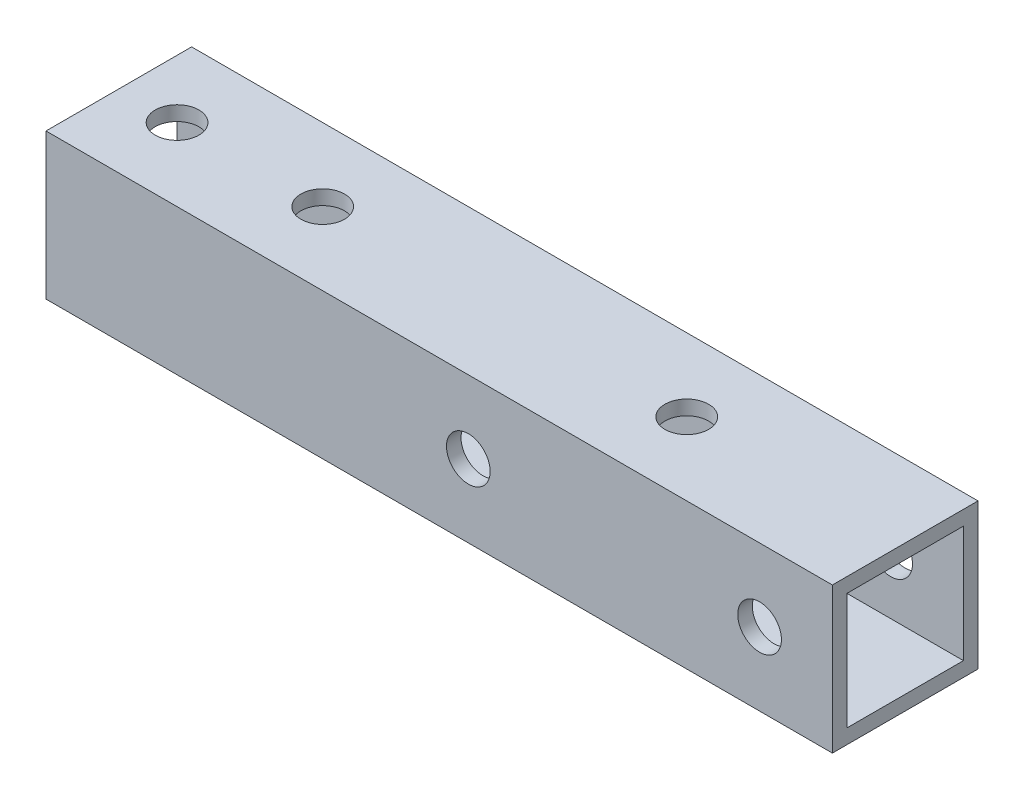
ISO-10303-21;
HEADER;
FILE_DESCRIPTION(('STEP AP214'),'2;1');
FILE_NAME('part.step','',(''),(''),'','','');
FILE_SCHEMA(('AUTOMOTIVE_DESIGN { 1 0 10303 214 1 1 1 1 }'));
ENDSEC;
DATA;
#1=APPLICATION_CONTEXT('core data for automotive mechanical design processes');
#2=APPLICATION_PROTOCOL_DEFINITION('international standard','automotive_design',2000,#1);
#3=PRODUCT_CONTEXT('',#1,'mechanical');
#4=PRODUCT('Part','Part','',(#3));
#5=PRODUCT_RELATED_PRODUCT_CATEGORY('part','',(#4));
#6=PRODUCT_DEFINITION_FORMATION('','',#4);
#7=PRODUCT_DEFINITION_CONTEXT('part definition',#1,'design');
#8=PRODUCT_DEFINITION('design','',#6,#7);
#9=PRODUCT_DEFINITION_SHAPE('','',#8);
#10=(LENGTH_UNIT() NAMED_UNIT(*) SI_UNIT(.MILLI.,.METRE.));
#11=(NAMED_UNIT(*) PLANE_ANGLE_UNIT() SI_UNIT($,.RADIAN.));
#12=(NAMED_UNIT(*) SI_UNIT($,.STERADIAN.) SOLID_ANGLE_UNIT());
#13=UNCERTAINTY_MEASURE_WITH_UNIT(LENGTH_MEASURE(1.E-05),#10,'distance_accuracy_value','');
#14=(GEOMETRIC_REPRESENTATION_CONTEXT(3) GLOBAL_UNCERTAINTY_ASSIGNED_CONTEXT((#13)) GLOBAL_UNIT_ASSIGNED_CONTEXT((#10,
#11,#12)) REPRESENTATION_CONTEXT('',''));
#15=CARTESIAN_POINT('',(0.,0.,0.));
#16=DIRECTION('',(0.,0.,1.));
#17=DIRECTION('',(1.,0.,0.));
#18=AXIS2_PLACEMENT_3D('',#15,#16,#17);
#19=CARTESIAN_POINT('',(54.,0.,0.));
#20=DIRECTION('',(1.,0.,0.));
#21=DIRECTION('',(0.,0.,-1.));
#22=AXIS2_PLACEMENT_3D('',#19,#20,#21);
#23=PLANE('',#22);
#24=DIRECTION('',(0.,1.,0.));
#25=VECTOR('',#24,1.);
#26=CARTESIAN_POINT('',(54.,-5.,-5.));
#27=LINE('',#26,#25);
#28=CARTESIAN_POINT('',(54.,-5.,-5.));
#29=VERTEX_POINT('',#28);
#30=CARTESIAN_POINT('',(54.,5.,-5.));
#31=VERTEX_POINT('',#30);
#32=EDGE_CURVE('E162',#29,#31,#27,.T.);
#33=ORIENTED_EDGE('',*,*,#32,.T.);
#34=DIRECTION('',(0.,0.,1.));
#35=VECTOR('',#34,1.);
#36=CARTESIAN_POINT('',(54.,5.,5.));
#37=LINE('',#36,#35);
#38=CARTESIAN_POINT('',(54.,5.,5.));
#39=VERTEX_POINT('',#38);
#40=EDGE_CURVE('E165',#31,#39,#37,.T.);
#41=ORIENTED_EDGE('',*,*,#40,.T.);
#42=DIRECTION('',(0.,-1.,0.));
#43=VECTOR('',#42,1.);
#44=CARTESIAN_POINT('',(54.,-5.,5.));
#45=LINE('',#44,#43);
#46=CARTESIAN_POINT('',(54.,-5.,5.));
#47=VERTEX_POINT('',#46);
#48=EDGE_CURVE('E168',#39,#47,#45,.T.);
#49=ORIENTED_EDGE('',*,*,#48,.T.);
#50=DIRECTION('',(0.,0.,-1.));
#51=VECTOR('',#50,1.);
#52=CARTESIAN_POINT('',(54.,-5.,5.));
#53=LINE('',#52,#51);
#54=EDGE_CURVE('E170',#47,#29,#53,.T.);
#55=ORIENTED_EDGE('',*,*,#54,.T.);
#56=EDGE_LOOP('',(#33,#41,#49,#55));
#57=FACE_BOUND('',#56,.T.);
#58=DIRECTION('',(0.,0.,1.));
#59=VECTOR('',#58,1.);
#60=CARTESIAN_POINT('',(54.,4.,0.));
#61=LINE('',#60,#59);
#62=CARTESIAN_POINT('',(54.,4.,-4.));
#63=VERTEX_POINT('',#62);
#64=CARTESIAN_POINT('',(54.,4.,4.));
#65=VERTEX_POINT('',#64);
#66=EDGE_CURVE('E132',#63,#65,#61,.T.);
#67=ORIENTED_EDGE('',*,*,#66,.F.);
#68=DIRECTION('',(0.,1.,0.));
#69=VECTOR('',#68,1.);
#70=CARTESIAN_POINT('',(54.,0.,-4.));
#71=LINE('',#70,#69);
#72=CARTESIAN_POINT('',(54.,-4.,-4.));
#73=VERTEX_POINT('',#72);
#74=EDGE_CURVE('E124',#73,#63,#71,.T.);
#75=ORIENTED_EDGE('',*,*,#74,.F.);
#76=DIRECTION('',(0.,0.,-1.));
#77=VECTOR('',#76,1.);
#78=CARTESIAN_POINT('',(54.,-4.,0.));
#79=LINE('',#78,#77);
#80=CARTESIAN_POINT('',(54.,-4.,4.));
#81=VERTEX_POINT('',#80);
#82=EDGE_CURVE('E146',#81,#73,#79,.T.);
#83=ORIENTED_EDGE('',*,*,#82,.F.);
#84=DIRECTION('',(0.,-1.,0.));
#85=VECTOR('',#84,1.);
#86=CARTESIAN_POINT('',(54.,0.,4.));
#87=LINE('',#86,#85);
#88=EDGE_CURVE('E144',#65,#81,#87,.T.);
#89=ORIENTED_EDGE('',*,*,#88,.F.);
#90=EDGE_LOOP('',(#67,#75,#83,#89));
#91=FACE_BOUND('',#90,.T.);
#92=ADVANCED_FACE('F57',(#57,#91),#23,.T.);
#93=CARTESIAN_POINT('',(0.,0.,0.));
#94=DIRECTION('',(1.,0.,0.));
#95=DIRECTION('',(0.,0.,-1.));
#96=AXIS2_PLACEMENT_3D('',#93,#94,#95);
#97=PLANE('',#96);
#98=DIRECTION('',(0.,1.,0.));
#99=VECTOR('',#98,1.);
#100=CARTESIAN_POINT('',(0.,-5.,-5.));
#101=LINE('',#100,#99);
#102=CARTESIAN_POINT('',(0.,-5.,-5.));
#103=VERTEX_POINT('',#102);
#104=CARTESIAN_POINT('',(0.,5.,-5.));
#105=VERTEX_POINT('',#104);
#106=EDGE_CURVE('E140',#103,#105,#101,.T.);
#107=ORIENTED_EDGE('',*,*,#106,.F.);
#108=DIRECTION('',(0.,0.,-1.));
#109=VECTOR('',#108,1.);
#110=CARTESIAN_POINT('',(0.,-5.,5.));
#111=LINE('',#110,#109);
#112=CARTESIAN_POINT('',(0.,-5.,5.));
#113=VERTEX_POINT('',#112);
#114=EDGE_CURVE('E166',#113,#103,#111,.T.);
#115=ORIENTED_EDGE('',*,*,#114,.F.);
#116=DIRECTION('',(0.,-1.,0.));
#117=VECTOR('',#116,1.);
#118=CARTESIAN_POINT('',(0.,-5.,5.));
#119=LINE('',#118,#117);
#120=CARTESIAN_POINT('',(0.,5.,5.));
#121=VERTEX_POINT('',#120);
#122=EDGE_CURVE('E177',#121,#113,#119,.T.);
#123=ORIENTED_EDGE('',*,*,#122,.F.);
#124=DIRECTION('',(0.,0.,1.));
#125=VECTOR('',#124,1.);
#126=CARTESIAN_POINT('',(0.,5.,5.));
#127=LINE('',#126,#125);
#128=EDGE_CURVE('E175',#105,#121,#127,.T.);
#129=ORIENTED_EDGE('',*,*,#128,.F.);
#130=EDGE_LOOP('',(#107,#115,#123,#129));
#131=FACE_BOUND('',#130,.T.);
#132=DIRECTION('',(0.,1.,0.));
#133=VECTOR('',#132,1.);
#134=CARTESIAN_POINT('',(0.,0.,-4.));
#135=LINE('',#134,#133);
#136=CARTESIAN_POINT('',(0.,-4.,-4.));
#137=VERTEX_POINT('',#136);
#138=CARTESIAN_POINT('',(0.,4.,-4.));
#139=VERTEX_POINT('',#138);
#140=EDGE_CURVE('E82',#137,#139,#135,.T.);
#141=ORIENTED_EDGE('',*,*,#140,.T.);
#142=DIRECTION('',(0.,0.,1.));
#143=VECTOR('',#142,1.);
#144=CARTESIAN_POINT('',(0.,4.,0.));
#145=LINE('',#144,#143);
#146=CARTESIAN_POINT('',(0.,4.,4.));
#147=VERTEX_POINT('',#146);
#148=EDGE_CURVE('E139',#139,#147,#145,.T.);
#149=ORIENTED_EDGE('',*,*,#148,.T.);
#150=DIRECTION('',(0.,-1.,0.));
#151=VECTOR('',#150,1.);
#152=CARTESIAN_POINT('',(0.,0.,4.));
#153=LINE('',#152,#151);
#154=CARTESIAN_POINT('',(0.,-4.,4.));
#155=VERTEX_POINT('',#154);
#156=EDGE_CURVE('E154',#147,#155,#153,.T.);
#157=ORIENTED_EDGE('',*,*,#156,.T.);
#158=DIRECTION('',(0.,0.,-1.));
#159=VECTOR('',#158,1.);
#160=CARTESIAN_POINT('',(0.,-4.,0.));
#161=LINE('',#160,#159);
#162=EDGE_CURVE('E133',#155,#137,#161,.T.);
#163=ORIENTED_EDGE('',*,*,#162,.T.);
#164=EDGE_LOOP('',(#141,#149,#157,#163));
#165=FACE_BOUND('',#164,.T.);
#166=ADVANCED_FACE('F280',(#131,#165),#97,.F.);
#167=CARTESIAN_POINT('',(54.,-5.,-5.));
#168=DIRECTION('',(0.,0.,1.));
#169=DIRECTION('',(1.,0.,0.));
#170=AXIS2_PLACEMENT_3D('',#167,#168,#169);
#171=PLANE('',#170);
#172=CARTESIAN_POINT('',(29.,0.,-5.));
#173=DIRECTION('',(0.,0.,1.));
#174=DIRECTION('',(1.,0.,0.));
#175=AXIS2_PLACEMENT_3D('',#172,#173,#174);
#176=CIRCLE('',#175,1.5);
#177=CARTESIAN_POINT('',(30.5,0.,-5.));
#178=VERTEX_POINT('',#177);
#179=EDGE_CURVE('E201',#178,#178,#176,.T.);
#180=ORIENTED_EDGE('',*,*,#179,.T.);
#181=EDGE_LOOP('',(#180));
#182=FACE_BOUND('',#181,.T.);
#183=CARTESIAN_POINT('',(49.,0.,-5.));
#184=DIRECTION('',(0.,0.,1.));
#185=DIRECTION('',(1.,0.,0.));
#186=AXIS2_PLACEMENT_3D('',#183,#184,#185);
#187=CIRCLE('',#186,1.5);
#188=CARTESIAN_POINT('',(50.5,0.,-5.));
#189=VERTEX_POINT('',#188);
#190=EDGE_CURVE('E212',#189,#189,#187,.T.);
#191=ORIENTED_EDGE('',*,*,#190,.T.);
#192=EDGE_LOOP('',(#191));
#193=FACE_BOUND('',#192,.T.);
#194=ORIENTED_EDGE('',*,*,#106,.T.);
#195=DIRECTION('',(-1.,0.,0.));
#196=VECTOR('',#195,1.);
#197=CARTESIAN_POINT('',(54.,5.,-5.));
#198=LINE('',#197,#196);
#199=EDGE_CURVE('E12',#31,#105,#198,.T.);
#200=ORIENTED_EDGE('',*,*,#199,.F.);
#201=ORIENTED_EDGE('',*,*,#32,.F.);
#202=DIRECTION('',(-1.,0.,0.));
#203=VECTOR('',#202,1.);
#204=CARTESIAN_POINT('',(54.,-5.,-5.));
#205=LINE('',#204,#203);
#206=EDGE_CURVE('E172',#29,#103,#205,.T.);
#207=ORIENTED_EDGE('',*,*,#206,.T.);
#208=EDGE_LOOP('',(#194,#200,#201,#207));
#209=FACE_BOUND('',#208,.T.);
#210=ADVANCED_FACE('F59',(#182,#193,#209),#171,.F.);
#211=CARTESIAN_POINT('',(54.,5.,5.));
#212=DIRECTION('',(0.,-1.,0.));
#213=DIRECTION('',(0.,0.,-1.));
#214=AXIS2_PLACEMENT_3D('',#211,#212,#213);
#215=PLANE('',#214);
#216=CARTESIAN_POINT('',(4.,5.,0.));
#217=DIRECTION('',(0.,1.,0.));
#218=DIRECTION('',(0.,0.,1.));
#219=AXIS2_PLACEMENT_3D('',#216,#217,#218);
#220=CIRCLE('',#219,1.5);
#221=CARTESIAN_POINT('',(4.,5.,1.5));
#222=VERTEX_POINT('',#221);
#223=EDGE_CURVE('E226',#222,#222,#220,.T.);
#224=ORIENTED_EDGE('',*,*,#223,.F.);
#225=EDGE_LOOP('',(#224));
#226=FACE_BOUND('',#225,.T.);
#227=CARTESIAN_POINT('',(14.,5.,0.));
#228=DIRECTION('',(0.,1.,0.));
#229=DIRECTION('',(0.,0.,1.));
#230=AXIS2_PLACEMENT_3D('',#227,#228,#229);
#231=CIRCLE('',#230,1.5);
#232=CARTESIAN_POINT('',(14.,5.,1.5));
#233=VERTEX_POINT('',#232);
#234=EDGE_CURVE('E232',#233,#233,#231,.T.);
#235=ORIENTED_EDGE('',*,*,#234,.F.);
#236=EDGE_LOOP('',(#235));
#237=FACE_BOUND('',#236,.T.);
#238=CARTESIAN_POINT('',(39.,5.,0.));
#239=DIRECTION('',(0.,1.,0.));
#240=DIRECTION('',(0.,0.,1.));
#241=AXIS2_PLACEMENT_3D('',#238,#239,#240);
#242=CIRCLE('',#241,1.5);
#243=CARTESIAN_POINT('',(39.,5.,1.5));
#244=VERTEX_POINT('',#243);
#245=EDGE_CURVE('E223',#244,#244,#242,.T.);
#246=ORIENTED_EDGE('',*,*,#245,.F.);
#247=EDGE_LOOP('',(#246));
#248=FACE_BOUND('',#247,.T.);
#249=ORIENTED_EDGE('',*,*,#128,.T.);
#250=DIRECTION('',(-1.,0.,0.));
#251=VECTOR('',#250,1.);
#252=CARTESIAN_POINT('',(54.,5.,5.));
#253=LINE('',#252,#251);
#254=EDGE_CURVE('E66',#39,#121,#253,.T.);
#255=ORIENTED_EDGE('',*,*,#254,.F.);
#256=ORIENTED_EDGE('',*,*,#40,.F.);
#257=ORIENTED_EDGE('',*,*,#199,.T.);
#258=EDGE_LOOP('',(#249,#255,#256,#257));
#259=FACE_BOUND('',#258,.T.);
#260=ADVANCED_FACE('F266',(#226,#237,#248,#259),#215,.F.);
#261=CARTESIAN_POINT('',(54.,-5.,5.));
#262=DIRECTION('',(0.,0.,-1.));
#263=DIRECTION('',(-1.,0.,0.));
#264=AXIS2_PLACEMENT_3D('',#261,#262,#263);
#265=PLANE('',#264);
#266=CARTESIAN_POINT('',(29.,0.,5.));
#267=DIRECTION('',(0.,0.,1.));
#268=DIRECTION('',(1.,0.,0.));
#269=AXIS2_PLACEMENT_3D('',#266,#267,#268);
#270=CIRCLE('',#269,1.5);
#271=CARTESIAN_POINT('',(30.5,0.,5.));
#272=VERTEX_POINT('',#271);
#273=EDGE_CURVE('E207',#272,#272,#270,.T.);
#274=ORIENTED_EDGE('',*,*,#273,.F.);
#275=EDGE_LOOP('',(#274));
#276=FACE_BOUND('',#275,.T.);
#277=CARTESIAN_POINT('',(49.,0.,5.));
#278=DIRECTION('',(0.,0.,1.));
#279=DIRECTION('',(1.,0.,0.));
#280=AXIS2_PLACEMENT_3D('',#277,#278,#279);
#281=CIRCLE('',#280,1.5);
#282=CARTESIAN_POINT('',(50.5,0.,5.));
#283=VERTEX_POINT('',#282);
#284=EDGE_CURVE('E217',#283,#283,#281,.T.);
#285=ORIENTED_EDGE('',*,*,#284,.F.);
#286=EDGE_LOOP('',(#285));
#287=FACE_BOUND('',#286,.T.);
#288=ORIENTED_EDGE('',*,*,#122,.T.);
#289=DIRECTION('',(-1.,0.,0.));
#290=VECTOR('',#289,1.);
#291=CARTESIAN_POINT('',(54.,-5.,5.));
#292=LINE('',#291,#290);
#293=EDGE_CURVE('E182',#47,#113,#292,.T.);
#294=ORIENTED_EDGE('',*,*,#293,.F.);
#295=ORIENTED_EDGE('',*,*,#48,.F.);
#296=ORIENTED_EDGE('',*,*,#254,.T.);
#297=EDGE_LOOP('',(#288,#294,#295,#296));
#298=FACE_BOUND('',#297,.T.);
#299=ADVANCED_FACE('F269',(#276,#287,#298),#265,.F.);
#300=CARTESIAN_POINT('',(54.,-5.,5.));
#301=DIRECTION('',(0.,1.,0.));
#302=DIRECTION('',(0.,0.,1.));
#303=AXIS2_PLACEMENT_3D('',#300,#301,#302);
#304=PLANE('',#303);
#305=CARTESIAN_POINT('',(4.,-5.,0.));
#306=DIRECTION('',(0.,1.,0.));
#307=DIRECTION('',(0.,0.,1.));
#308=AXIS2_PLACEMENT_3D('',#305,#306,#307);
#309=CIRCLE('',#308,1.5);
#310=CARTESIAN_POINT('',(4.,-5.,1.5));
#311=VERTEX_POINT('',#310);
#312=EDGE_CURVE('E191',#311,#311,#309,.T.);
#313=ORIENTED_EDGE('',*,*,#312,.T.);
#314=EDGE_LOOP('',(#313));
#315=FACE_BOUND('',#314,.T.);
#316=CARTESIAN_POINT('',(14.,-5.,0.));
#317=DIRECTION('',(0.,1.,0.));
#318=DIRECTION('',(0.,0.,1.));
#319=AXIS2_PLACEMENT_3D('',#316,#317,#318);
#320=CIRCLE('',#319,1.5);
#321=CARTESIAN_POINT('',(14.,-5.,1.5));
#322=VERTEX_POINT('',#321);
#323=EDGE_CURVE('E229',#322,#322,#320,.T.);
#324=ORIENTED_EDGE('',*,*,#323,.T.);
#325=EDGE_LOOP('',(#324));
#326=FACE_BOUND('',#325,.T.);
#327=CARTESIAN_POINT('',(39.,-5.,0.));
#328=DIRECTION('',(0.,1.,0.));
#329=DIRECTION('',(0.,0.,1.));
#330=AXIS2_PLACEMENT_3D('',#327,#328,#329);
#331=CIRCLE('',#330,1.5);
#332=CARTESIAN_POINT('',(39.,-5.,1.5));
#333=VERTEX_POINT('',#332);
#334=EDGE_CURVE('E235',#333,#333,#331,.T.);
#335=ORIENTED_EDGE('',*,*,#334,.T.);
#336=EDGE_LOOP('',(#335));
#337=FACE_BOUND('',#336,.T.);
#338=ORIENTED_EDGE('',*,*,#114,.T.);
#339=ORIENTED_EDGE('',*,*,#206,.F.);
#340=ORIENTED_EDGE('',*,*,#54,.F.);
#341=ORIENTED_EDGE('',*,*,#293,.T.);
#342=EDGE_LOOP('',(#338,#339,#340,#341));
#343=FACE_BOUND('',#342,.T.);
#344=ADVANCED_FACE('F284',(#315,#326,#337,#343),#304,.F.);
#345=CARTESIAN_POINT('',(54.,0.,-4.));
#346=DIRECTION('',(0.,0.,1.));
#347=DIRECTION('',(1.,0.,0.));
#348=AXIS2_PLACEMENT_3D('',#345,#346,#347);
#349=PLANE('',#348);
#350=CARTESIAN_POINT('',(29.,0.,-4.));
#351=DIRECTION('',(0.,0.,1.));
#352=DIRECTION('',(1.,0.,0.));
#353=AXIS2_PLACEMENT_3D('',#350,#351,#352);
#354=CIRCLE('',#353,1.5);
#355=CARTESIAN_POINT('',(30.5,0.,-4.));
#356=VERTEX_POINT('',#355);
#357=EDGE_CURVE('E220',#356,#356,#354,.T.);
#358=ORIENTED_EDGE('',*,*,#357,.F.);
#359=EDGE_LOOP('',(#358));
#360=FACE_BOUND('',#359,.T.);
#361=CARTESIAN_POINT('',(49.,0.,-4.));
#362=DIRECTION('',(0.,0.,1.));
#363=DIRECTION('',(1.,0.,0.));
#364=AXIS2_PLACEMENT_3D('',#361,#362,#363);
#365=CIRCLE('',#364,1.5);
#366=CARTESIAN_POINT('',(50.5,0.,-4.));
#367=VERTEX_POINT('',#366);
#368=EDGE_CURVE('E200',#367,#367,#365,.T.);
#369=ORIENTED_EDGE('',*,*,#368,.F.);
#370=EDGE_LOOP('',(#369));
#371=FACE_BOUND('',#370,.T.);
#372=ORIENTED_EDGE('',*,*,#140,.F.);
#373=DIRECTION('',(-1.,0.,0.));
#374=VECTOR('',#373,1.);
#375=CARTESIAN_POINT('',(54.,-4.,-4.));
#376=LINE('',#375,#374);
#377=EDGE_CURVE('E128',#73,#137,#376,.T.);
#378=ORIENTED_EDGE('',*,*,#377,.F.);
#379=ORIENTED_EDGE('',*,*,#74,.T.);
#380=DIRECTION('',(-1.,0.,0.));
#381=VECTOR('',#380,1.);
#382=CARTESIAN_POINT('',(54.,4.,-4.));
#383=LINE('',#382,#381);
#384=EDGE_CURVE('E127',#63,#139,#383,.T.);
#385=ORIENTED_EDGE('',*,*,#384,.T.);
#386=EDGE_LOOP('',(#372,#378,#379,#385));
#387=FACE_BOUND('',#386,.T.);
#388=ADVANCED_FACE('F126',(#360,#371,#387),#349,.T.);
#389=CARTESIAN_POINT('',(54.,4.,0.));
#390=DIRECTION('',(0.,-1.,0.));
#391=DIRECTION('',(0.,0.,-1.));
#392=AXIS2_PLACEMENT_3D('',#389,#390,#391);
#393=PLANE('',#392);
#394=CARTESIAN_POINT('',(4.,4.,0.));
#395=DIRECTION('',(0.,-1.,0.));
#396=DIRECTION('',(0.,0.,-1.));
#397=AXIS2_PLACEMENT_3D('',#394,#395,#396);
#398=CIRCLE('',#397,1.5);
#399=CARTESIAN_POINT('',(4.,4.,-1.5));
#400=VERTEX_POINT('',#399);
#401=EDGE_CURVE('E152',#400,#400,#398,.T.);
#402=ORIENTED_EDGE('',*,*,#401,.F.);
#403=EDGE_LOOP('',(#402));
#404=FACE_BOUND('',#403,.T.);
#405=CARTESIAN_POINT('',(14.,4.,0.));
#406=DIRECTION('',(0.,-1.,0.));
#407=DIRECTION('',(0.,0.,-1.));
#408=AXIS2_PLACEMENT_3D('',#405,#406,#407);
#409=CIRCLE('',#408,1.5);
#410=CARTESIAN_POINT('',(14.,4.,-1.5));
#411=VERTEX_POINT('',#410);
#412=EDGE_CURVE('E195',#411,#411,#409,.T.);
#413=ORIENTED_EDGE('',*,*,#412,.F.);
#414=EDGE_LOOP('',(#413));
#415=FACE_BOUND('',#414,.T.);
#416=CARTESIAN_POINT('',(39.,4.,0.));
#417=DIRECTION('',(0.,-1.,0.));
#418=DIRECTION('',(0.,0.,-1.));
#419=AXIS2_PLACEMENT_3D('',#416,#417,#418);
#420=CIRCLE('',#419,1.5);
#421=CARTESIAN_POINT('',(39.,4.,-1.5));
#422=VERTEX_POINT('',#421);
#423=EDGE_CURVE('E190',#422,#422,#420,.T.);
#424=ORIENTED_EDGE('',*,*,#423,.F.);
#425=EDGE_LOOP('',(#424));
#426=FACE_BOUND('',#425,.T.);
#427=ORIENTED_EDGE('',*,*,#148,.F.);
#428=ORIENTED_EDGE('',*,*,#384,.F.);
#429=ORIENTED_EDGE('',*,*,#66,.T.);
#430=DIRECTION('',(-1.,0.,0.));
#431=VECTOR('',#430,1.);
#432=CARTESIAN_POINT('',(54.,4.,4.));
#433=LINE('',#432,#431);
#434=EDGE_CURVE('E141',#65,#147,#433,.T.);
#435=ORIENTED_EDGE('',*,*,#434,.T.);
#436=EDGE_LOOP('',(#427,#428,#429,#435));
#437=FACE_BOUND('',#436,.T.);
#438=ADVANCED_FACE('F136',(#404,#415,#426,#437),#393,.T.);
#439=CARTESIAN_POINT('',(54.,0.,4.));
#440=DIRECTION('',(0.,0.,-1.));
#441=DIRECTION('',(-1.,0.,0.));
#442=AXIS2_PLACEMENT_3D('',#439,#440,#441);
#443=PLANE('',#442);
#444=CARTESIAN_POINT('',(29.,0.,4.));
#445=DIRECTION('',(0.,0.,-1.));
#446=DIRECTION('',(-1.,0.,0.));
#447=AXIS2_PLACEMENT_3D('',#444,#445,#446);
#448=CIRCLE('',#447,1.5);
#449=CARTESIAN_POINT('',(27.5,0.,4.));
#450=VERTEX_POINT('',#449);
#451=EDGE_CURVE('E61',#450,#450,#448,.T.);
#452=ORIENTED_EDGE('',*,*,#451,.F.);
#453=EDGE_LOOP('',(#452));
#454=FACE_BOUND('',#453,.T.);
#455=CARTESIAN_POINT('',(49.,0.,4.));
#456=DIRECTION('',(0.,0.,-1.));
#457=DIRECTION('',(-1.,0.,0.));
#458=AXIS2_PLACEMENT_3D('',#455,#456,#457);
#459=CIRCLE('',#458,1.5);
#460=CARTESIAN_POINT('',(47.5,0.,4.));
#461=VERTEX_POINT('',#460);
#462=EDGE_CURVE('E198',#461,#461,#459,.T.);
#463=ORIENTED_EDGE('',*,*,#462,.F.);
#464=EDGE_LOOP('',(#463));
#465=FACE_BOUND('',#464,.T.);
#466=ORIENTED_EDGE('',*,*,#156,.F.);
#467=ORIENTED_EDGE('',*,*,#434,.F.);
#468=ORIENTED_EDGE('',*,*,#88,.T.);
#469=DIRECTION('',(-1.,0.,0.));
#470=VECTOR('',#469,1.);
#471=CARTESIAN_POINT('',(54.,-4.,4.));
#472=LINE('',#471,#470);
#473=EDGE_CURVE('E74',#81,#155,#472,.T.);
#474=ORIENTED_EDGE('',*,*,#473,.T.);
#475=EDGE_LOOP('',(#466,#467,#468,#474));
#476=FACE_BOUND('',#475,.T.);
#477=ADVANCED_FACE('F251',(#454,#465,#476),#443,.T.);
#478=CARTESIAN_POINT('',(54.,-4.,0.));
#479=DIRECTION('',(0.,1.,0.));
#480=DIRECTION('',(0.,0.,1.));
#481=AXIS2_PLACEMENT_3D('',#478,#479,#480);
#482=PLANE('',#481);
#483=CARTESIAN_POINT('',(4.,-4.,0.));
#484=DIRECTION('',(0.,1.,0.));
#485=DIRECTION('',(0.,0.,1.));
#486=AXIS2_PLACEMENT_3D('',#483,#484,#485);
#487=CIRCLE('',#486,1.5);
#488=CARTESIAN_POINT('',(4.,-4.,1.5));
#489=VERTEX_POINT('',#488);
#490=EDGE_CURVE('E196',#489,#489,#487,.T.);
#491=ORIENTED_EDGE('',*,*,#490,.F.);
#492=EDGE_LOOP('',(#491));
#493=FACE_BOUND('',#492,.T.);
#494=CARTESIAN_POINT('',(14.,-4.,0.));
#495=DIRECTION('',(0.,1.,0.));
#496=DIRECTION('',(0.,0.,1.));
#497=AXIS2_PLACEMENT_3D('',#494,#495,#496);
#498=CIRCLE('',#497,1.5);
#499=CARTESIAN_POINT('',(14.,-4.,1.5));
#500=VERTEX_POINT('',#499);
#501=EDGE_CURVE('E192',#500,#500,#498,.T.);
#502=ORIENTED_EDGE('',*,*,#501,.F.);
#503=EDGE_LOOP('',(#502));
#504=FACE_BOUND('',#503,.T.);
#505=CARTESIAN_POINT('',(39.,-4.,0.));
#506=DIRECTION('',(0.,1.,0.));
#507=DIRECTION('',(0.,0.,1.));
#508=AXIS2_PLACEMENT_3D('',#505,#506,#507);
#509=CIRCLE('',#508,1.5);
#510=CARTESIAN_POINT('',(39.,-4.,1.5));
#511=VERTEX_POINT('',#510);
#512=EDGE_CURVE('E187',#511,#511,#509,.T.);
#513=ORIENTED_EDGE('',*,*,#512,.F.);
#514=EDGE_LOOP('',(#513));
#515=FACE_BOUND('',#514,.T.);
#516=ORIENTED_EDGE('',*,*,#162,.F.);
#517=ORIENTED_EDGE('',*,*,#473,.F.);
#518=ORIENTED_EDGE('',*,*,#82,.T.);
#519=ORIENTED_EDGE('',*,*,#377,.T.);
#520=EDGE_LOOP('',(#516,#517,#518,#519));
#521=FACE_BOUND('',#520,.T.);
#522=ADVANCED_FACE('F365',(#493,#504,#515,#521),#482,.T.);
#523=CARTESIAN_POINT('',(39.,-5.,0.));
#524=DIRECTION('',(0.,1.,0.));
#525=DIRECTION('',(0.,0.,1.));
#526=AXIS2_PLACEMENT_3D('',#523,#524,#525);
#527=CYLINDRICAL_SURFACE('',#526,1.5);
#528=ORIENTED_EDGE('',*,*,#512,.T.);
#529=EDGE_LOOP('',(#528));
#530=FACE_BOUND('',#529,.T.);
#531=ORIENTED_EDGE('',*,*,#334,.F.);
#532=EDGE_LOOP('',(#531));
#533=FACE_BOUND('',#532,.T.);
#534=ADVANCED_FACE('F263',(#530,#533),#527,.F.);
#535=CARTESIAN_POINT('',(14.,-5.,0.));
#536=DIRECTION('',(0.,1.,0.));
#537=DIRECTION('',(0.,0.,1.));
#538=AXIS2_PLACEMENT_3D('',#535,#536,#537);
#539=CYLINDRICAL_SURFACE('',#538,1.5);
#540=ORIENTED_EDGE('',*,*,#501,.T.);
#541=EDGE_LOOP('',(#540));
#542=FACE_BOUND('',#541,.T.);
#543=ORIENTED_EDGE('',*,*,#323,.F.);
#544=EDGE_LOOP('',(#543));
#545=FACE_BOUND('',#544,.T.);
#546=ADVANCED_FACE('F379',(#542,#545),#539,.F.);
#547=CARTESIAN_POINT('',(4.,-5.,0.));
#548=DIRECTION('',(0.,1.,0.));
#549=DIRECTION('',(0.,0.,1.));
#550=AXIS2_PLACEMENT_3D('',#547,#548,#549);
#551=CYLINDRICAL_SURFACE('',#550,1.5);
#552=ORIENTED_EDGE('',*,*,#490,.T.);
#553=EDGE_LOOP('',(#552));
#554=FACE_BOUND('',#553,.T.);
#555=ORIENTED_EDGE('',*,*,#312,.F.);
#556=EDGE_LOOP('',(#555));
#557=FACE_BOUND('',#556,.T.);
#558=ADVANCED_FACE('F261',(#554,#557),#551,.F.);
#559=ORIENTED_EDGE('',*,*,#423,.T.);
#560=EDGE_LOOP('',(#559));
#561=FACE_BOUND('',#560,.T.);
#562=ORIENTED_EDGE('',*,*,#245,.T.);
#563=EDGE_LOOP('',(#562));
#564=FACE_BOUND('',#563,.T.);
#565=ADVANCED_FACE('F257',(#561,#564),#527,.F.);
#566=ORIENTED_EDGE('',*,*,#412,.T.);
#567=EDGE_LOOP('',(#566));
#568=FACE_BOUND('',#567,.T.);
#569=ORIENTED_EDGE('',*,*,#234,.T.);
#570=EDGE_LOOP('',(#569));
#571=FACE_BOUND('',#570,.T.);
#572=ADVANCED_FACE('F260',(#568,#571),#539,.F.);
#573=ORIENTED_EDGE('',*,*,#401,.T.);
#574=EDGE_LOOP('',(#573));
#575=FACE_BOUND('',#574,.T.);
#576=ORIENTED_EDGE('',*,*,#223,.T.);
#577=EDGE_LOOP('',(#576));
#578=FACE_BOUND('',#577,.T.);
#579=ADVANCED_FACE('F246',(#575,#578),#551,.F.);
#580=CARTESIAN_POINT('',(49.,0.,-5.));
#581=DIRECTION('',(0.,0.,1.));
#582=DIRECTION('',(1.,0.,0.));
#583=AXIS2_PLACEMENT_3D('',#580,#581,#582);
#584=CYLINDRICAL_SURFACE('',#583,1.5);
#585=ORIENTED_EDGE('',*,*,#462,.T.);
#586=EDGE_LOOP('',(#585));
#587=FACE_BOUND('',#586,.T.);
#588=ORIENTED_EDGE('',*,*,#284,.T.);
#589=EDGE_LOOP('',(#588));
#590=FACE_BOUND('',#589,.T.);
#591=ADVANCED_FACE('F308',(#587,#590),#584,.F.);
#592=CARTESIAN_POINT('',(29.,0.,-5.));
#593=DIRECTION('',(0.,0.,1.));
#594=DIRECTION('',(1.,0.,0.));
#595=AXIS2_PLACEMENT_3D('',#592,#593,#594);
#596=CYLINDRICAL_SURFACE('',#595,1.5);
#597=ORIENTED_EDGE('',*,*,#451,.T.);
#598=EDGE_LOOP('',(#597));
#599=FACE_BOUND('',#598,.T.);
#600=ORIENTED_EDGE('',*,*,#273,.T.);
#601=EDGE_LOOP('',(#600));
#602=FACE_BOUND('',#601,.T.);
#603=ADVANCED_FACE('F310',(#599,#602),#596,.F.);
#604=ORIENTED_EDGE('',*,*,#368,.T.);
#605=EDGE_LOOP('',(#604));
#606=FACE_BOUND('',#605,.T.);
#607=ORIENTED_EDGE('',*,*,#190,.F.);
#608=EDGE_LOOP('',(#607));
#609=FACE_BOUND('',#608,.T.);
#610=ADVANCED_FACE('F312',(#606,#609),#584,.F.);
#611=ORIENTED_EDGE('',*,*,#357,.T.);
#612=EDGE_LOOP('',(#611));
#613=FACE_BOUND('',#612,.T.);
#614=ORIENTED_EDGE('',*,*,#179,.F.);
#615=EDGE_LOOP('',(#614));
#616=FACE_BOUND('',#615,.T.);
#617=ADVANCED_FACE('F319',(#613,#616),#596,.F.);
#618=CLOSED_SHELL('',(#92,#166,#210,#260,#299,#344,#388,#438,#477,#522,#534,#546,#558,#565,#572,
#579,#591,#603,#610,#617));
#619=MANIFOLD_SOLID_BREP('B2',#618);
#620=ADVANCED_BREP_SHAPE_REPRESENTATION('',(#18,#619),#14);
#621=SHAPE_DEFINITION_REPRESENTATION(#9,#620);
ENDSEC;
END-ISO-10303-21;
